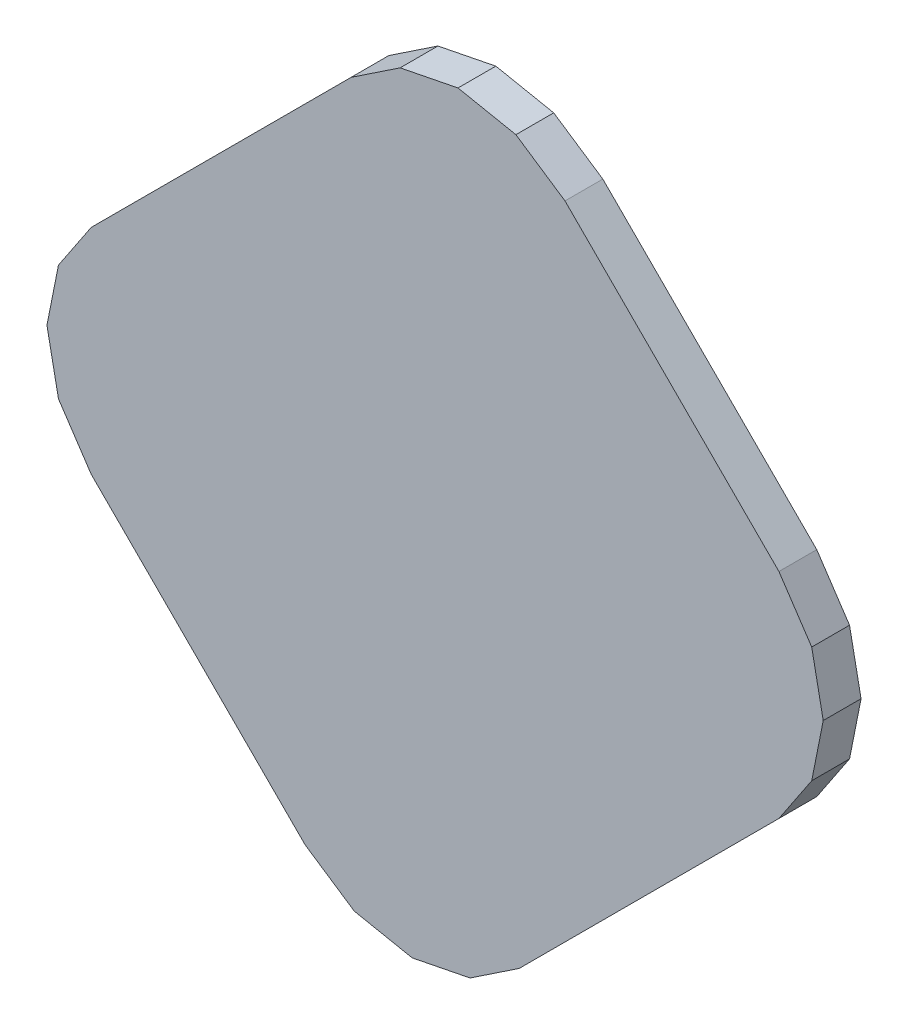
ISO-10303-21;
HEADER;
FILE_DESCRIPTION(('STEP AP214'),'2;1');
FILE_NAME('part.step','',(''),(''),'','','');
FILE_SCHEMA(('AUTOMOTIVE_DESIGN { 1 0 10303 214 1 1 1 1 }'));
ENDSEC;
DATA;
#1=APPLICATION_CONTEXT('core data for automotive mechanical design processes');
#2=APPLICATION_PROTOCOL_DEFINITION('international standard','automotive_design',2000,#1);
#3=PRODUCT_CONTEXT('',#1,'mechanical');
#4=PRODUCT('Part','Part','',(#3));
#5=PRODUCT_RELATED_PRODUCT_CATEGORY('part','',(#4));
#6=PRODUCT_DEFINITION_FORMATION('','',#4);
#7=PRODUCT_DEFINITION_CONTEXT('part definition',#1,'design');
#8=PRODUCT_DEFINITION('design','',#6,#7);
#9=PRODUCT_DEFINITION_SHAPE('','',#8);
#10=(LENGTH_UNIT() NAMED_UNIT(*) SI_UNIT(.MILLI.,.METRE.));
#11=(NAMED_UNIT(*) PLANE_ANGLE_UNIT() SI_UNIT($,.RADIAN.));
#12=(NAMED_UNIT(*) SI_UNIT($,.STERADIAN.) SOLID_ANGLE_UNIT());
#13=UNCERTAINTY_MEASURE_WITH_UNIT(LENGTH_MEASURE(1.E-05),#10,'distance_accuracy_value','');
#14=(GEOMETRIC_REPRESENTATION_CONTEXT(3) GLOBAL_UNCERTAINTY_ASSIGNED_CONTEXT((#13)) GLOBAL_UNIT_ASSIGNED_CONTEXT((#10,
#11,#12)) REPRESENTATION_CONTEXT('',''));
#15=CARTESIAN_POINT('',(0.,0.,0.));
#16=DIRECTION('',(0.,0.,1.));
#17=DIRECTION('',(1.,0.,0.));
#18=AXIS2_PLACEMENT_3D('',#15,#16,#17);
#19=CARTESIAN_POINT('',(95.900589,-125.450589,1.635));
#20=DIRECTION('',(0.,0.,-1.));
#21=DIRECTION('',(0.,-1.,0.));
#22=AXIS2_PLACEMENT_3D('',#19,#20,#21);
#23=PLANE('',#22);
#24=DIRECTION('',(0.980785031686367,-0.195091572396073,0.));
#25=VECTOR('',#24,1.);
#26=CARTESIAN_POINT('',(95.921802,-125.091386,1.635));
#27=LINE('',#26,#25);
#28=CARTESIAN_POINT('',(95.921802,-125.091386,1.635));
#29=VERTEX_POINT('',#28);
#30=CARTESIAN_POINT('',(95.975378,-125.102043,1.635));
#31=VERTEX_POINT('',#30);
#32=EDGE_CURVE('E27',#29,#31,#27,.T.);
#33=ORIENTED_EDGE('',*,*,#32,.F.);
#34=DIRECTION('',(0.980784334911873,0.195095075261975,0.));
#35=VECTOR('',#34,1.);
#36=CARTESIAN_POINT('',(95.868227,-125.102043,1.635));
#37=LINE('',#36,#35);
#38=CARTESIAN_POINT('',(95.868227,-125.102043,1.635));
#39=VERTEX_POINT('',#38);
#40=EDGE_CURVE('E159',#39,#29,#37,.T.);
#41=ORIENTED_EDGE('',*,*,#40,.F.);
#42=DIRECTION('',(0.831475309652738,0.555561706237825,0.));
#43=VECTOR('',#42,1.);
#44=CARTESIAN_POINT('',(95.822807,-125.132391,1.635));
#45=LINE('',#44,#43);
#46=CARTESIAN_POINT('',(95.822807,-125.132391,1.635));
#47=VERTEX_POINT('',#46);
#48=EDGE_CURVE('E162',#47,#39,#45,.T.);
#49=ORIENTED_EDGE('',*,*,#48,.F.);
#50=DIRECTION('',(0.707106781186548,0.707106781186548,0.));
#51=VECTOR('',#50,1.);
#52=CARTESIAN_POINT('',(95.582391,-125.372807,1.635));
#53=LINE('',#52,#51);
#54=CARTESIAN_POINT('',(95.582391,-125.372807,1.635));
#55=VERTEX_POINT('',#54);
#56=EDGE_CURVE('E250',#55,#47,#53,.T.);
#57=ORIENTED_EDGE('',*,*,#56,.F.);
#58=DIRECTION('',(0.555561706237825,0.831475309652738,0.));
#59=VECTOR('',#58,1.);
#60=CARTESIAN_POINT('',(95.552043,-125.418227,1.635));
#61=LINE('',#60,#59);
#62=CARTESIAN_POINT('',(95.552043,-125.418227,1.635));
#63=VERTEX_POINT('',#62);
#64=EDGE_CURVE('E195',#63,#55,#61,.T.);
#65=ORIENTED_EDGE('',*,*,#64,.F.);
#66=DIRECTION('',(0.195095075261975,0.980784334911873,0.));
#67=VECTOR('',#66,1.);
#68=CARTESIAN_POINT('',(95.541386,-125.471802,1.635));
#69=LINE('',#68,#67);
#70=CARTESIAN_POINT('',(95.541386,-125.471802,1.635));
#71=VERTEX_POINT('',#70);
#72=EDGE_CURVE('E242',#71,#63,#69,.T.);
#73=ORIENTED_EDGE('',*,*,#72,.F.);
#74=DIRECTION('',(-0.195091572396073,0.980785031686367,0.));
#75=VECTOR('',#74,1.);
#76=CARTESIAN_POINT('',(95.552043,-125.525378,1.635));
#77=LINE('',#76,#75);
#78=CARTESIAN_POINT('',(95.552043,-125.525378,1.635));
#79=VERTEX_POINT('',#78);
#80=EDGE_CURVE('E233',#79,#71,#77,.T.);
#81=ORIENTED_EDGE('',*,*,#80,.F.);
#82=DIRECTION('',(-0.555570162706272,0.831469659284406,0.));
#83=VECTOR('',#82,1.);
#84=CARTESIAN_POINT('',(95.582391,-125.570797,1.635));
#85=LINE('',#84,#83);
#86=CARTESIAN_POINT('',(95.582391,-125.570797,1.635));
#87=VERTEX_POINT('',#86);
#88=EDGE_CURVE('E224',#87,#79,#85,.T.);
#89=ORIENTED_EDGE('',*,*,#88,.F.);
#90=DIRECTION('',(-0.707106781186548,0.707106781186548,0.));
#91=VECTOR('',#90,1.);
#92=CARTESIAN_POINT('',(95.780381,-125.768787,1.635));
#93=LINE('',#92,#91);
#94=CARTESIAN_POINT('',(95.780381,-125.768787,1.635));
#95=VERTEX_POINT('',#94);
#96=EDGE_CURVE('E218',#95,#87,#93,.T.);
#97=ORIENTED_EDGE('',*,*,#96,.F.);
#98=DIRECTION('',(-0.831469659284406,0.555570162706272,0.));
#99=VECTOR('',#98,1.);
#100=CARTESIAN_POINT('',(95.8258,-125.799135,1.635));
#101=LINE('',#100,#99);
#102=CARTESIAN_POINT('',(95.8258,-125.799135,1.635));
#103=VERTEX_POINT('',#102);
#104=EDGE_CURVE('E209',#103,#95,#101,.T.);
#105=ORIENTED_EDGE('',*,*,#104,.F.);
#106=DIRECTION('',(-0.980785031686367,0.195091572396073,0.));
#107=VECTOR('',#106,1.);
#108=CARTESIAN_POINT('',(95.879376,-125.809792,1.635));
#109=LINE('',#108,#107);
#110=CARTESIAN_POINT('',(95.879376,-125.809792,1.635));
#111=VERTEX_POINT('',#110);
#112=EDGE_CURVE('E194',#111,#103,#109,.T.);
#113=ORIENTED_EDGE('',*,*,#112,.F.);
#114=DIRECTION('',(-0.980784334911873,-0.195095075261975,0.));
#115=VECTOR('',#114,1.);
#116=CARTESIAN_POINT('',(95.932951,-125.799135,1.635));
#117=LINE('',#116,#115);
#118=CARTESIAN_POINT('',(95.932951,-125.799135,1.635));
#119=VERTEX_POINT('',#118);
#120=EDGE_CURVE('E182',#119,#111,#117,.T.);
#121=ORIENTED_EDGE('',*,*,#120,.F.);
#122=DIRECTION('',(-0.831475309652429,-0.555561706238287,0.));
#123=VECTOR('',#122,1.);
#124=CARTESIAN_POINT('',(95.978371,-125.768787,1.635));
#125=LINE('',#124,#123);
#126=CARTESIAN_POINT('',(95.978371,-125.768787,1.635));
#127=VERTEX_POINT('',#126);
#128=EDGE_CURVE('E172',#127,#119,#125,.T.);
#129=ORIENTED_EDGE('',*,*,#128,.F.);
#130=DIRECTION('',(-0.707106781186548,-0.707106781186548,0.));
#131=VECTOR('',#130,1.);
#132=CARTESIAN_POINT('',(96.218787,-125.528371,1.635));
#133=LINE('',#132,#131);
#134=CARTESIAN_POINT('',(96.218787,-125.528371,1.635));
#135=VERTEX_POINT('',#134);
#136=EDGE_CURVE('E335',#135,#127,#133,.T.);
#137=ORIENTED_EDGE('',*,*,#136,.F.);
#138=DIRECTION('',(-0.555561706237825,-0.831475309652738,0.));
#139=VECTOR('',#138,1.);
#140=CARTESIAN_POINT('',(96.249135,-125.482951,1.635));
#141=LINE('',#140,#139);
#142=CARTESIAN_POINT('',(96.249135,-125.482951,1.635));
#143=VERTEX_POINT('',#142);
#144=EDGE_CURVE('E359',#143,#135,#141,.T.);
#145=ORIENTED_EDGE('',*,*,#144,.F.);
#146=DIRECTION('',(-0.195095075261975,-0.980784334911873,0.));
#147=VECTOR('',#146,1.);
#148=CARTESIAN_POINT('',(96.259792,-125.429376,1.635));
#149=LINE('',#148,#147);
#150=CARTESIAN_POINT('',(96.259792,-125.429376,1.635));
#151=VERTEX_POINT('',#150);
#152=EDGE_CURVE('E344',#151,#143,#149,.T.);
#153=ORIENTED_EDGE('',*,*,#152,.F.);
#154=DIRECTION('',(0.195091572396073,-0.980785031686367,0.));
#155=VECTOR('',#154,1.);
#156=CARTESIAN_POINT('',(96.249135,-125.3758,1.635));
#157=LINE('',#156,#155);
#158=CARTESIAN_POINT('',(96.249135,-125.3758,1.635));
#159=VERTEX_POINT('',#158);
#160=EDGE_CURVE('E305',#159,#151,#157,.T.);
#161=ORIENTED_EDGE('',*,*,#160,.F.);
#162=DIRECTION('',(0.555570162706272,-0.831469659284406,0.));
#163=VECTOR('',#162,1.);
#164=CARTESIAN_POINT('',(96.218787,-125.330381,1.635));
#165=LINE('',#164,#163);
#166=CARTESIAN_POINT('',(96.218787,-125.330381,1.635));
#167=VERTEX_POINT('',#166);
#168=EDGE_CURVE('E307',#167,#159,#165,.T.);
#169=ORIENTED_EDGE('',*,*,#168,.F.);
#170=DIRECTION('',(0.707106781186548,-0.707106781186548,0.));
#171=VECTOR('',#170,1.);
#172=CARTESIAN_POINT('',(96.020797,-125.132391,1.635));
#173=LINE('',#172,#171);
#174=CARTESIAN_POINT('',(96.020797,-125.132391,1.635));
#175=VERTEX_POINT('',#174);
#176=EDGE_CURVE('E278',#175,#167,#173,.T.);
#177=ORIENTED_EDGE('',*,*,#176,.F.);
#178=DIRECTION('',(0.831469659284406,-0.555570162706272,0.));
#179=VECTOR('',#178,1.);
#180=CARTESIAN_POINT('',(95.975378,-125.102043,1.635));
#181=LINE('',#180,#179);
#182=EDGE_CURVE('E275',#31,#175,#181,.T.);
#183=ORIENTED_EDGE('',*,*,#182,.F.);
#184=EDGE_LOOP('',(#33,#41,#49,#57,#65,#73,#81,#89,#97,#105,#113,#121,#129,#137,#145,#153,#161,
#169,#177,#183));
#185=FACE_BOUND('',#184,.T.);
#186=ADVANCED_FACE('F17',(#185),#23,.F.);
#187=CARTESIAN_POINT('',(95.900589,-125.450589,1.6));
#188=DIRECTION('',(0.,0.,-1.));
#189=DIRECTION('',(0.,-1.,0.));
#190=AXIS2_PLACEMENT_3D('',#187,#188,#189);
#191=PLANE('',#190);
#192=DIRECTION('',(0.831469659284406,-0.555570162706272,0.));
#193=VECTOR('',#192,1.);
#194=CARTESIAN_POINT('',(95.975378,-125.102043,1.6));
#195=LINE('',#194,#193);
#196=CARTESIAN_POINT('',(95.975378,-125.102043,1.6));
#197=VERTEX_POINT('',#196);
#198=CARTESIAN_POINT('',(96.020797,-125.132391,1.6));
#199=VERTEX_POINT('',#198);
#200=EDGE_CURVE('E287',#197,#199,#195,.T.);
#201=ORIENTED_EDGE('',*,*,#200,.T.);
#202=DIRECTION('',(0.707106781186548,-0.707106781186548,0.));
#203=VECTOR('',#202,1.);
#204=CARTESIAN_POINT('',(96.020797,-125.132391,1.6));
#205=LINE('',#204,#203);
#206=CARTESIAN_POINT('',(96.218787,-125.330381,1.6));
#207=VERTEX_POINT('',#206);
#208=EDGE_CURVE('E311',#199,#207,#205,.T.);
#209=ORIENTED_EDGE('',*,*,#208,.T.);
#210=DIRECTION('',(0.555570162706272,-0.831469659284406,0.));
#211=VECTOR('',#210,1.);
#212=CARTESIAN_POINT('',(96.218787,-125.330381,1.6));
#213=LINE('',#212,#211);
#214=CARTESIAN_POINT('',(96.249135,-125.3758,1.6));
#215=VERTEX_POINT('',#214);
#216=EDGE_CURVE('E301',#207,#215,#213,.T.);
#217=ORIENTED_EDGE('',*,*,#216,.T.);
#218=DIRECTION('',(0.195091572396073,-0.980785031686367,0.));
#219=VECTOR('',#218,1.);
#220=CARTESIAN_POINT('',(96.249135,-125.3758,1.6));
#221=LINE('',#220,#219);
#222=CARTESIAN_POINT('',(96.259792,-125.429376,1.6));
#223=VERTEX_POINT('',#222);
#224=EDGE_CURVE('E340',#215,#223,#221,.T.);
#225=ORIENTED_EDGE('',*,*,#224,.T.);
#226=DIRECTION('',(-0.195095075261975,-0.980784334911873,0.));
#227=VECTOR('',#226,1.);
#228=CARTESIAN_POINT('',(96.259792,-125.429376,1.6));
#229=LINE('',#228,#227);
#230=CARTESIAN_POINT('',(96.249135,-125.482951,1.6));
#231=VERTEX_POINT('',#230);
#232=EDGE_CURVE('E355',#223,#231,#229,.T.);
#233=ORIENTED_EDGE('',*,*,#232,.T.);
#234=DIRECTION('',(-0.555561706237825,-0.831475309652738,0.));
#235=VECTOR('',#234,1.);
#236=CARTESIAN_POINT('',(96.249135,-125.482951,1.6));
#237=LINE('',#236,#235);
#238=CARTESIAN_POINT('',(96.218787,-125.528371,1.6));
#239=VERTEX_POINT('',#238);
#240=EDGE_CURVE('E331',#231,#239,#237,.T.);
#241=ORIENTED_EDGE('',*,*,#240,.T.);
#242=DIRECTION('',(-0.707106781186548,-0.707106781186548,0.));
#243=VECTOR('',#242,1.);
#244=CARTESIAN_POINT('',(96.218787,-125.528371,1.6));
#245=LINE('',#244,#243);
#246=CARTESIAN_POINT('',(95.978371,-125.768787,1.6));
#247=VERTEX_POINT('',#246);
#248=EDGE_CURVE('E384',#239,#247,#245,.T.);
#249=ORIENTED_EDGE('',*,*,#248,.T.);
#250=DIRECTION('',(-0.831475309652429,-0.555561706238287,0.));
#251=VECTOR('',#250,1.);
#252=CARTESIAN_POINT('',(95.978371,-125.768787,1.6));
#253=LINE('',#252,#251);
#254=CARTESIAN_POINT('',(95.932951,-125.799135,1.6));
#255=VERTEX_POINT('',#254);
#256=EDGE_CURVE('E178',#247,#255,#253,.T.);
#257=ORIENTED_EDGE('',*,*,#256,.T.);
#258=DIRECTION('',(-0.980784334911873,-0.195095075261975,0.));
#259=VECTOR('',#258,1.);
#260=CARTESIAN_POINT('',(95.932951,-125.799135,1.6));
#261=LINE('',#260,#259);
#262=CARTESIAN_POINT('',(95.879376,-125.809792,1.6));
#263=VERTEX_POINT('',#262);
#264=EDGE_CURVE('E190',#255,#263,#261,.T.);
#265=ORIENTED_EDGE('',*,*,#264,.T.);
#266=DIRECTION('',(-0.980785031686367,0.195091572396073,0.));
#267=VECTOR('',#266,1.);
#268=CARTESIAN_POINT('',(95.879376,-125.809792,1.6));
#269=LINE('',#268,#267);
#270=CARTESIAN_POINT('',(95.8258,-125.799135,1.6));
#271=VERTEX_POINT('',#270);
#272=EDGE_CURVE('E205',#263,#271,#269,.T.);
#273=ORIENTED_EDGE('',*,*,#272,.T.);
#274=DIRECTION('',(-0.831469659284406,0.555570162706272,0.));
#275=VECTOR('',#274,1.);
#276=CARTESIAN_POINT('',(95.8258,-125.799135,1.6));
#277=LINE('',#276,#275);
#278=CARTESIAN_POINT('',(95.780381,-125.768787,1.6));
#279=VERTEX_POINT('',#278);
#280=EDGE_CURVE('E214',#271,#279,#277,.T.);
#281=ORIENTED_EDGE('',*,*,#280,.T.);
#282=DIRECTION('',(-0.707106781186548,0.707106781186548,0.));
#283=VECTOR('',#282,1.);
#284=CARTESIAN_POINT('',(95.780381,-125.768787,1.6));
#285=LINE('',#284,#283);
#286=CARTESIAN_POINT('',(95.582391,-125.570797,1.6));
#287=VERTEX_POINT('',#286);
#288=EDGE_CURVE('E223',#279,#287,#285,.T.);
#289=ORIENTED_EDGE('',*,*,#288,.T.);
#290=DIRECTION('',(-0.555570162706272,0.831469659284406,0.));
#291=VECTOR('',#290,1.);
#292=CARTESIAN_POINT('',(95.582391,-125.570797,1.6));
#293=LINE('',#292,#291);
#294=CARTESIAN_POINT('',(95.552043,-125.525378,1.6));
#295=VERTEX_POINT('',#294);
#296=EDGE_CURVE('E232',#287,#295,#293,.T.);
#297=ORIENTED_EDGE('',*,*,#296,.T.);
#298=DIRECTION('',(-0.195091572396073,0.980785031686367,0.));
#299=VECTOR('',#298,1.);
#300=CARTESIAN_POINT('',(95.552043,-125.525378,1.6));
#301=LINE('',#300,#299);
#302=CARTESIAN_POINT('',(95.541386,-125.471802,1.6));
#303=VERTEX_POINT('',#302);
#304=EDGE_CURVE('E238',#295,#303,#301,.T.);
#305=ORIENTED_EDGE('',*,*,#304,.T.);
#306=DIRECTION('',(0.195095075261975,0.980784334911873,0.));
#307=VECTOR('',#306,1.);
#308=CARTESIAN_POINT('',(95.541386,-125.471802,1.6));
#309=LINE('',#308,#307);
#310=CARTESIAN_POINT('',(95.552043,-125.418227,1.6));
#311=VERTEX_POINT('',#310);
#312=EDGE_CURVE('E200',#303,#311,#309,.T.);
#313=ORIENTED_EDGE('',*,*,#312,.T.);
#314=DIRECTION('',(0.555561706237825,0.831475309652738,0.));
#315=VECTOR('',#314,1.);
#316=CARTESIAN_POINT('',(95.552043,-125.418227,1.6));
#317=LINE('',#316,#315);
#318=CARTESIAN_POINT('',(95.582391,-125.372807,1.6));
#319=VERTEX_POINT('',#318);
#320=EDGE_CURVE('E251',#311,#319,#317,.T.);
#321=ORIENTED_EDGE('',*,*,#320,.T.);
#322=DIRECTION('',(0.707106781186548,0.707106781186548,0.));
#323=VECTOR('',#322,1.);
#324=CARTESIAN_POINT('',(95.582391,-125.372807,1.6));
#325=LINE('',#324,#323);
#326=CARTESIAN_POINT('',(95.822807,-125.132391,1.6));
#327=VERTEX_POINT('',#326);
#328=EDGE_CURVE('E154',#319,#327,#325,.T.);
#329=ORIENTED_EDGE('',*,*,#328,.T.);
#330=DIRECTION('',(0.831475309652738,0.555561706237825,0.));
#331=VECTOR('',#330,1.);
#332=CARTESIAN_POINT('',(95.822807,-125.132391,1.6));
#333=LINE('',#332,#331);
#334=CARTESIAN_POINT('',(95.868227,-125.102043,1.6));
#335=VERTEX_POINT('',#334);
#336=EDGE_CURVE('E150',#327,#335,#333,.T.);
#337=ORIENTED_EDGE('',*,*,#336,.T.);
#338=DIRECTION('',(0.980784334911873,0.195095075261975,0.));
#339=VECTOR('',#338,1.);
#340=CARTESIAN_POINT('',(95.868227,-125.102043,1.6));
#341=LINE('',#340,#339);
#342=CARTESIAN_POINT('',(95.921802,-125.091386,1.6));
#343=VERTEX_POINT('',#342);
#344=EDGE_CURVE('E138',#335,#343,#341,.T.);
#345=ORIENTED_EDGE('',*,*,#344,.T.);
#346=DIRECTION('',(0.980785031686367,-0.195091572396073,0.));
#347=VECTOR('',#346,1.);
#348=CARTESIAN_POINT('',(95.921802,-125.091386,1.6));
#349=LINE('',#348,#347);
#350=EDGE_CURVE('E11',#343,#197,#349,.T.);
#351=ORIENTED_EDGE('',*,*,#350,.T.);
#352=EDGE_LOOP('',(#201,#209,#217,#225,#233,#241,#249,#257,#265,#273,#281,#289,#297,#305,#313,
#321,#329,#337,#345,#351));
#353=FACE_BOUND('',#352,.T.);
#354=ADVANCED_FACE('F152',(#353),#191,.T.);
#355=CARTESIAN_POINT('',(95.921802,-125.091386,1.6));
#356=DIRECTION('',(0.195091572396073,0.980785031686367,0.));
#357=DIRECTION('',(0.,0.,-1.));
#358=AXIS2_PLACEMENT_3D('',#355,#356,#357);
#359=PLANE('',#358);
#360=DIRECTION('',(0.,0.,1.));
#361=VECTOR('',#360,1.);
#362=CARTESIAN_POINT('',(95.921802,-125.091386,1.6));
#363=LINE('',#362,#361);
#364=EDGE_CURVE('E145',#343,#29,#363,.T.);
#365=ORIENTED_EDGE('',*,*,#364,.T.);
#366=ORIENTED_EDGE('',*,*,#32,.T.);
#367=DIRECTION('',(0.,0.,1.));
#368=VECTOR('',#367,1.);
#369=CARTESIAN_POINT('',(95.975378,-125.102043,1.6));
#370=LINE('',#369,#368);
#371=EDGE_CURVE('E268',#197,#31,#370,.T.);
#372=ORIENTED_EDGE('',*,*,#371,.F.);
#373=ORIENTED_EDGE('',*,*,#350,.F.);
#374=EDGE_LOOP('',(#365,#366,#372,#373));
#375=FACE_BOUND('',#374,.T.);
#376=ADVANCED_FACE('F19',(#375),#359,.T.);
#377=CARTESIAN_POINT('',(95.868227,-125.102043,1.6));
#378=DIRECTION('',(-0.195095075261975,0.980784334911873,0.));
#379=DIRECTION('',(0.,0.,1.));
#380=AXIS2_PLACEMENT_3D('',#377,#378,#379);
#381=PLANE('',#380);
#382=DIRECTION('',(0.,0.,1.));
#383=VECTOR('',#382,1.);
#384=CARTESIAN_POINT('',(95.868227,-125.102043,1.6));
#385=LINE('',#384,#383);
#386=EDGE_CURVE('E143',#335,#39,#385,.T.);
#387=ORIENTED_EDGE('',*,*,#386,.T.);
#388=ORIENTED_EDGE('',*,*,#40,.T.);
#389=ORIENTED_EDGE('',*,*,#364,.F.);
#390=ORIENTED_EDGE('',*,*,#344,.F.);
#391=EDGE_LOOP('',(#387,#388,#389,#390));
#392=FACE_BOUND('',#391,.T.);
#393=ADVANCED_FACE('F140',(#392),#381,.T.);
#394=CARTESIAN_POINT('',(95.822807,-125.132391,1.6));
#395=DIRECTION('',(-0.555561706237825,0.831475309652738,0.));
#396=DIRECTION('',(0.,0.,1.));
#397=AXIS2_PLACEMENT_3D('',#394,#395,#396);
#398=PLANE('',#397);
#399=DIRECTION('',(0.,0.,1.));
#400=VECTOR('',#399,1.);
#401=CARTESIAN_POINT('',(95.822807,-125.132391,1.6));
#402=LINE('',#401,#400);
#403=EDGE_CURVE('E247',#327,#47,#402,.T.);
#404=ORIENTED_EDGE('',*,*,#403,.T.);
#405=ORIENTED_EDGE('',*,*,#48,.T.);
#406=ORIENTED_EDGE('',*,*,#386,.F.);
#407=ORIENTED_EDGE('',*,*,#336,.F.);
#408=EDGE_LOOP('',(#404,#405,#406,#407));
#409=FACE_BOUND('',#408,.T.);
#410=ADVANCED_FACE('F161',(#409),#398,.T.);
#411=CARTESIAN_POINT('',(95.582391,-125.372807,1.6));
#412=DIRECTION('',(-0.707106781186548,0.707106781186548,0.));
#413=DIRECTION('',(0.,0.,1.));
#414=AXIS2_PLACEMENT_3D('',#411,#412,#413);
#415=PLANE('',#414);
#416=DIRECTION('',(0.,0.,1.));
#417=VECTOR('',#416,1.);
#418=CARTESIAN_POINT('',(95.582391,-125.372807,1.6));
#419=LINE('',#418,#417);
#420=EDGE_CURVE('E199',#319,#55,#419,.T.);
#421=ORIENTED_EDGE('',*,*,#420,.T.);
#422=ORIENTED_EDGE('',*,*,#56,.T.);
#423=ORIENTED_EDGE('',*,*,#403,.F.);
#424=ORIENTED_EDGE('',*,*,#328,.F.);
#425=EDGE_LOOP('',(#421,#422,#423,#424));
#426=FACE_BOUND('',#425,.T.);
#427=ADVANCED_FACE('F403',(#426),#415,.T.);
#428=CARTESIAN_POINT('',(95.552043,-125.418227,1.6));
#429=DIRECTION('',(-0.831475309652738,0.555561706237825,0.));
#430=DIRECTION('',(0.,0.,1.));
#431=AXIS2_PLACEMENT_3D('',#428,#429,#430);
#432=PLANE('',#431);
#433=DIRECTION('',(0.,0.,1.));
#434=VECTOR('',#433,1.);
#435=CARTESIAN_POINT('',(95.552043,-125.418227,1.6));
#436=LINE('',#435,#434);
#437=EDGE_CURVE('E246',#311,#63,#436,.T.);
#438=ORIENTED_EDGE('',*,*,#437,.T.);
#439=ORIENTED_EDGE('',*,*,#64,.T.);
#440=ORIENTED_EDGE('',*,*,#420,.F.);
#441=ORIENTED_EDGE('',*,*,#320,.F.);
#442=EDGE_LOOP('',(#438,#439,#440,#441));
#443=FACE_BOUND('',#442,.T.);
#444=ADVANCED_FACE('F397',(#443),#432,.T.);
#445=CARTESIAN_POINT('',(95.541386,-125.471802,1.6));
#446=DIRECTION('',(-0.980784334911873,0.195095075261975,0.));
#447=DIRECTION('',(0.,0.,1.));
#448=AXIS2_PLACEMENT_3D('',#445,#446,#447);
#449=PLANE('',#448);
#450=DIRECTION('',(0.,0.,1.));
#451=VECTOR('',#450,1.);
#452=CARTESIAN_POINT('',(95.541386,-125.471802,1.6));
#453=LINE('',#452,#451);
#454=EDGE_CURVE('E236',#303,#71,#453,.T.);
#455=ORIENTED_EDGE('',*,*,#454,.T.);
#456=ORIENTED_EDGE('',*,*,#72,.T.);
#457=ORIENTED_EDGE('',*,*,#437,.F.);
#458=ORIENTED_EDGE('',*,*,#312,.F.);
#459=EDGE_LOOP('',(#455,#456,#457,#458));
#460=FACE_BOUND('',#459,.T.);
#461=ADVANCED_FACE('F400',(#460),#449,.T.);
#462=CARTESIAN_POINT('',(95.552043,-125.525378,1.6));
#463=DIRECTION('',(-0.980785031686367,-0.195091572396073,0.));
#464=DIRECTION('',(-0.195091572396073,0.980785031686367,0.));
#465=AXIS2_PLACEMENT_3D('',#462,#463,#464);
#466=PLANE('',#465);
#467=DIRECTION('',(0.,0.,1.));
#468=VECTOR('',#467,1.);
#469=CARTESIAN_POINT('',(95.552043,-125.525378,1.6));
#470=LINE('',#469,#468);
#471=EDGE_CURVE('E228',#295,#79,#470,.T.);
#472=ORIENTED_EDGE('',*,*,#471,.T.);
#473=ORIENTED_EDGE('',*,*,#80,.T.);
#474=ORIENTED_EDGE('',*,*,#454,.F.);
#475=ORIENTED_EDGE('',*,*,#304,.F.);
#476=EDGE_LOOP('',(#472,#473,#474,#475));
#477=FACE_BOUND('',#476,.T.);
#478=ADVANCED_FACE('F406',(#477),#466,.T.);
#479=CARTESIAN_POINT('',(95.582391,-125.570797,1.6));
#480=DIRECTION('',(-0.831469659284406,-0.555570162706272,0.));
#481=DIRECTION('',(-0.555570162706272,0.831469659284406,0.));
#482=AXIS2_PLACEMENT_3D('',#479,#480,#481);
#483=PLANE('',#482);
#484=DIRECTION('',(0.,0.,1.));
#485=VECTOR('',#484,1.);
#486=CARTESIAN_POINT('',(95.582391,-125.570797,1.6));
#487=LINE('',#486,#485);
#488=EDGE_CURVE('E219',#287,#87,#487,.T.);
#489=ORIENTED_EDGE('',*,*,#488,.T.);
#490=ORIENTED_EDGE('',*,*,#88,.T.);
#491=ORIENTED_EDGE('',*,*,#471,.F.);
#492=ORIENTED_EDGE('',*,*,#296,.F.);
#493=EDGE_LOOP('',(#489,#490,#491,#492));
#494=FACE_BOUND('',#493,.T.);
#495=ADVANCED_FACE('F408',(#494),#483,.T.);
#496=CARTESIAN_POINT('',(95.780381,-125.768787,1.6));
#497=DIRECTION('',(-0.707106781186548,-0.707106781186548,0.));
#498=DIRECTION('',(-0.707106781186548,0.707106781186548,0.));
#499=AXIS2_PLACEMENT_3D('',#496,#497,#498);
#500=PLANE('',#499);
#501=DIRECTION('',(0.,0.,1.));
#502=VECTOR('',#501,1.);
#503=CARTESIAN_POINT('',(95.780381,-125.768787,1.6));
#504=LINE('',#503,#502);
#505=EDGE_CURVE('E210',#279,#95,#504,.T.);
#506=ORIENTED_EDGE('',*,*,#505,.T.);
#507=ORIENTED_EDGE('',*,*,#96,.T.);
#508=ORIENTED_EDGE('',*,*,#488,.F.);
#509=ORIENTED_EDGE('',*,*,#288,.F.);
#510=EDGE_LOOP('',(#506,#507,#508,#509));
#511=FACE_BOUND('',#510,.T.);
#512=ADVANCED_FACE('F412',(#511),#500,.T.);
#513=CARTESIAN_POINT('',(95.8258,-125.799135,1.6));
#514=DIRECTION('',(-0.555570162706272,-0.831469659284406,0.));
#515=DIRECTION('',(-0.831469659284406,0.555570162706272,0.));
#516=AXIS2_PLACEMENT_3D('',#513,#514,#515);
#517=PLANE('',#516);
#518=DIRECTION('',(0.,0.,1.));
#519=VECTOR('',#518,1.);
#520=CARTESIAN_POINT('',(95.8258,-125.799135,1.6));
#521=LINE('',#520,#519);
#522=EDGE_CURVE('E201',#271,#103,#521,.T.);
#523=ORIENTED_EDGE('',*,*,#522,.T.);
#524=ORIENTED_EDGE('',*,*,#104,.T.);
#525=ORIENTED_EDGE('',*,*,#505,.F.);
#526=ORIENTED_EDGE('',*,*,#280,.F.);
#527=EDGE_LOOP('',(#523,#524,#525,#526));
#528=FACE_BOUND('',#527,.T.);
#529=ADVANCED_FACE('F414',(#528),#517,.T.);
#530=CARTESIAN_POINT('',(95.879376,-125.809792,1.6));
#531=DIRECTION('',(-0.195091572396073,-0.980785031686367,0.));
#532=DIRECTION('',(-0.980785031686367,0.195091572396073,0.));
#533=AXIS2_PLACEMENT_3D('',#530,#531,#532);
#534=PLANE('',#533);
#535=DIRECTION('',(0.,0.,1.));
#536=VECTOR('',#535,1.);
#537=CARTESIAN_POINT('',(95.879376,-125.809792,1.6));
#538=LINE('',#537,#536);
#539=EDGE_CURVE('E186',#263,#111,#538,.T.);
#540=ORIENTED_EDGE('',*,*,#539,.T.);
#541=ORIENTED_EDGE('',*,*,#112,.T.);
#542=ORIENTED_EDGE('',*,*,#522,.F.);
#543=ORIENTED_EDGE('',*,*,#272,.F.);
#544=EDGE_LOOP('',(#540,#541,#542,#543));
#545=FACE_BOUND('',#544,.T.);
#546=ADVANCED_FACE('F417',(#545),#534,.T.);
#547=CARTESIAN_POINT('',(95.932951,-125.799135,1.6));
#548=DIRECTION('',(0.195095075261975,-0.980784334911873,0.));
#549=DIRECTION('',(0.,0.,-1.));
#550=AXIS2_PLACEMENT_3D('',#547,#548,#549);
#551=PLANE('',#550);
#552=DIRECTION('',(0.,0.,1.));
#553=VECTOR('',#552,1.);
#554=CARTESIAN_POINT('',(95.932951,-125.799135,1.6));
#555=LINE('',#554,#553);
#556=EDGE_CURVE('E174',#255,#119,#555,.T.);
#557=ORIENTED_EDGE('',*,*,#556,.T.);
#558=ORIENTED_EDGE('',*,*,#120,.T.);
#559=ORIENTED_EDGE('',*,*,#539,.F.);
#560=ORIENTED_EDGE('',*,*,#264,.F.);
#561=EDGE_LOOP('',(#557,#558,#559,#560));
#562=FACE_BOUND('',#561,.T.);
#563=ADVANCED_FACE('F424',(#562),#551,.T.);
#564=CARTESIAN_POINT('',(95.978371,-125.768787,1.6));
#565=DIRECTION('',(0.555561706238287,-0.831475309652429,0.));
#566=DIRECTION('',(0.,0.,-1.));
#567=AXIS2_PLACEMENT_3D('',#564,#565,#566);
#568=PLANE('',#567);
#569=DIRECTION('',(0.,0.,1.));
#570=VECTOR('',#569,1.);
#571=CARTESIAN_POINT('',(95.978371,-125.768787,1.6));
#572=LINE('',#571,#570);
#573=EDGE_CURVE('E381',#247,#127,#572,.T.);
#574=ORIENTED_EDGE('',*,*,#573,.T.);
#575=ORIENTED_EDGE('',*,*,#128,.T.);
#576=ORIENTED_EDGE('',*,*,#556,.F.);
#577=ORIENTED_EDGE('',*,*,#256,.F.);
#578=EDGE_LOOP('',(#574,#575,#576,#577));
#579=FACE_BOUND('',#578,.T.);
#580=ADVANCED_FACE('F426',(#579),#568,.T.);
#581=CARTESIAN_POINT('',(96.218787,-125.528371,1.6));
#582=DIRECTION('',(0.707106781186548,-0.707106781186548,0.));
#583=DIRECTION('',(0.,0.,-1.));
#584=AXIS2_PLACEMENT_3D('',#581,#582,#583);
#585=PLANE('',#584);
#586=DIRECTION('',(0.,0.,1.));
#587=VECTOR('',#586,1.);
#588=CARTESIAN_POINT('',(96.218787,-125.528371,1.6));
#589=LINE('',#588,#587);
#590=EDGE_CURVE('E336',#239,#135,#589,.T.);
#591=ORIENTED_EDGE('',*,*,#590,.T.);
#592=ORIENTED_EDGE('',*,*,#136,.T.);
#593=ORIENTED_EDGE('',*,*,#573,.F.);
#594=ORIENTED_EDGE('',*,*,#248,.F.);
#595=EDGE_LOOP('',(#591,#592,#593,#594));
#596=FACE_BOUND('',#595,.T.);
#597=ADVANCED_FACE('F663',(#596),#585,.T.);
#598=CARTESIAN_POINT('',(96.249135,-125.482951,1.6));
#599=DIRECTION('',(0.831475309652738,-0.555561706237825,0.));
#600=DIRECTION('',(0.,0.,-1.));
#601=AXIS2_PLACEMENT_3D('',#598,#599,#600);
#602=PLANE('',#601);
#603=DIRECTION('',(0.,0.,1.));
#604=VECTOR('',#603,1.);
#605=CARTESIAN_POINT('',(96.249135,-125.482951,1.6));
#606=LINE('',#605,#604);
#607=EDGE_CURVE('E348',#231,#143,#606,.T.);
#608=ORIENTED_EDGE('',*,*,#607,.T.);
#609=ORIENTED_EDGE('',*,*,#144,.T.);
#610=ORIENTED_EDGE('',*,*,#590,.F.);
#611=ORIENTED_EDGE('',*,*,#240,.F.);
#612=EDGE_LOOP('',(#608,#609,#610,#611));
#613=FACE_BOUND('',#612,.T.);
#614=ADVANCED_FACE('F657',(#613),#602,.T.);
#615=CARTESIAN_POINT('',(96.259792,-125.429376,1.6));
#616=DIRECTION('',(0.980784334911873,-0.195095075261975,0.));
#617=DIRECTION('',(0.,0.,-1.));
#618=AXIS2_PLACEMENT_3D('',#615,#616,#617);
#619=PLANE('',#618);
#620=DIRECTION('',(0.,0.,1.));
#621=VECTOR('',#620,1.);
#622=CARTESIAN_POINT('',(96.259792,-125.429376,1.6));
#623=LINE('',#622,#621);
#624=EDGE_CURVE('E327',#223,#151,#623,.T.);
#625=ORIENTED_EDGE('',*,*,#624,.T.);
#626=ORIENTED_EDGE('',*,*,#152,.T.);
#627=ORIENTED_EDGE('',*,*,#607,.F.);
#628=ORIENTED_EDGE('',*,*,#232,.F.);
#629=EDGE_LOOP('',(#625,#626,#627,#628));
#630=FACE_BOUND('',#629,.T.);
#631=ADVANCED_FACE('F662',(#630),#619,.T.);
#632=CARTESIAN_POINT('',(96.249135,-125.3758,1.6));
#633=DIRECTION('',(0.980785031686367,0.195091572396073,0.));
#634=DIRECTION('',(0.,0.,-1.));
#635=AXIS2_PLACEMENT_3D('',#632,#633,#634);
#636=PLANE('',#635);
#637=DIRECTION('',(0.,0.,1.));
#638=VECTOR('',#637,1.);
#639=CARTESIAN_POINT('',(96.249135,-125.3758,1.6));
#640=LINE('',#639,#638);
#641=EDGE_CURVE('E306',#215,#159,#640,.T.);
#642=ORIENTED_EDGE('',*,*,#641,.T.);
#643=ORIENTED_EDGE('',*,*,#160,.T.);
#644=ORIENTED_EDGE('',*,*,#624,.F.);
#645=ORIENTED_EDGE('',*,*,#224,.F.);
#646=EDGE_LOOP('',(#642,#643,#644,#645));
#647=FACE_BOUND('',#646,.T.);
#648=ADVANCED_FACE('F651',(#647),#636,.T.);
#649=CARTESIAN_POINT('',(96.218787,-125.330381,1.6));
#650=DIRECTION('',(0.831469659284406,0.555570162706272,0.));
#651=DIRECTION('',(0.,0.,-1.));
#652=AXIS2_PLACEMENT_3D('',#649,#650,#651);
#653=PLANE('',#652);
#654=DIRECTION('',(0.,0.,1.));
#655=VECTOR('',#654,1.);
#656=CARTESIAN_POINT('',(96.218787,-125.330381,1.6));
#657=LINE('',#656,#655);
#658=EDGE_CURVE('E314',#207,#167,#657,.T.);
#659=ORIENTED_EDGE('',*,*,#658,.T.);
#660=ORIENTED_EDGE('',*,*,#168,.T.);
#661=ORIENTED_EDGE('',*,*,#641,.F.);
#662=ORIENTED_EDGE('',*,*,#216,.F.);
#663=EDGE_LOOP('',(#659,#660,#661,#662));
#664=FACE_BOUND('',#663,.T.);
#665=ADVANCED_FACE('F642',(#664),#653,.T.);
#666=CARTESIAN_POINT('',(96.020797,-125.132391,1.6));
#667=DIRECTION('',(0.707106781186548,0.707106781186548,0.));
#668=DIRECTION('',(0.,0.,-1.));
#669=AXIS2_PLACEMENT_3D('',#666,#667,#668);
#670=PLANE('',#669);
#671=DIRECTION('',(0.,0.,1.));
#672=VECTOR('',#671,1.);
#673=CARTESIAN_POINT('',(96.020797,-125.132391,1.6));
#674=LINE('',#673,#672);
#675=EDGE_CURVE('E283',#199,#175,#674,.T.);
#676=ORIENTED_EDGE('',*,*,#675,.T.);
#677=ORIENTED_EDGE('',*,*,#176,.T.);
#678=ORIENTED_EDGE('',*,*,#658,.F.);
#679=ORIENTED_EDGE('',*,*,#208,.F.);
#680=EDGE_LOOP('',(#676,#677,#678,#679));
#681=FACE_BOUND('',#680,.T.);
#682=ADVANCED_FACE('F617',(#681),#670,.T.);
#683=CARTESIAN_POINT('',(95.975378,-125.102043,1.6));
#684=DIRECTION('',(0.555570162706272,0.831469659284406,0.));
#685=DIRECTION('',(0.,0.,-1.));
#686=AXIS2_PLACEMENT_3D('',#683,#684,#685);
#687=PLANE('',#686);
#688=ORIENTED_EDGE('',*,*,#371,.T.);
#689=ORIENTED_EDGE('',*,*,#182,.T.);
#690=ORIENTED_EDGE('',*,*,#675,.F.);
#691=ORIENTED_EDGE('',*,*,#200,.F.);
#692=EDGE_LOOP('',(#688,#689,#690,#691));
#693=FACE_BOUND('',#692,.T.);
#694=ADVANCED_FACE('F286',(#693),#687,.T.);
#695=CLOSED_SHELL('',(#186,#354,#376,#393,#410,#427,#444,#461,#478,#495,#512,#529,#546,#563,
#580,#597,#614,#631,#648,#665,#682,#694));
#696=MANIFOLD_SOLID_BREP('B1',#695);
#697=ADVANCED_BREP_SHAPE_REPRESENTATION('',(#18,#696),#14);
#698=SHAPE_DEFINITION_REPRESENTATION(#9,#697);
ENDSEC;
END-ISO-10303-21;
